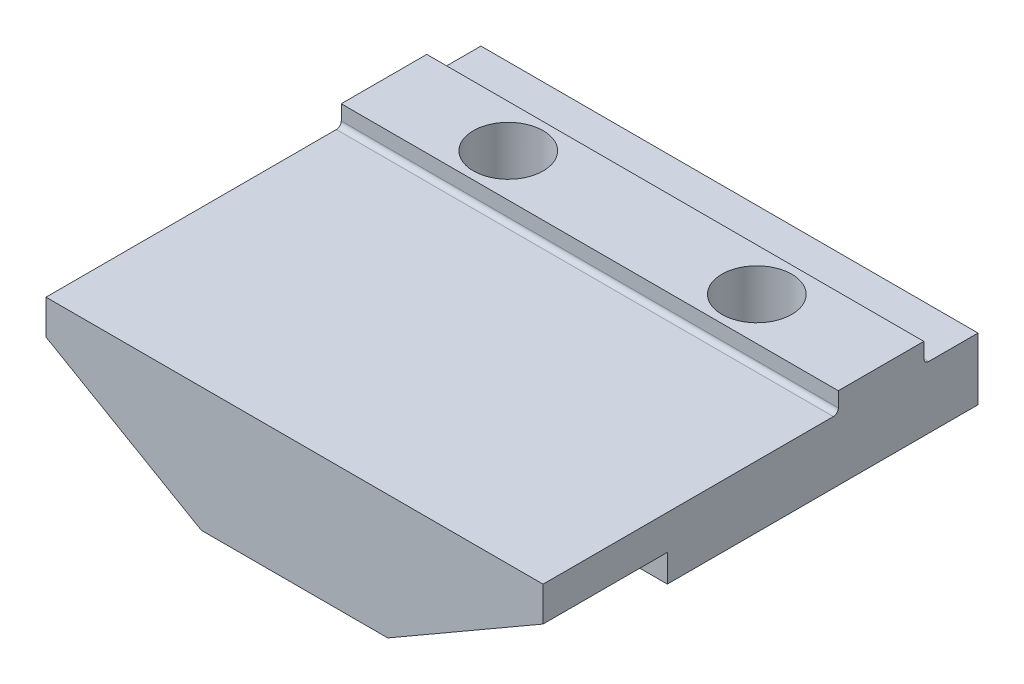
ISO-10303-21;
HEADER;
FILE_DESCRIPTION(('STEP AP214'),'2;1');
FILE_NAME('part.step','',(''),(''),'','','');
FILE_SCHEMA(('AUTOMOTIVE_DESIGN { 1 0 10303 214 1 1 1 1 }'));
ENDSEC;
DATA;
#1=APPLICATION_CONTEXT('core data for automotive mechanical design processes');
#2=APPLICATION_PROTOCOL_DEFINITION('international standard','automotive_design',2000,#1);
#3=PRODUCT_CONTEXT('',#1,'mechanical');
#4=PRODUCT('Part','Part','',(#3));
#5=PRODUCT_RELATED_PRODUCT_CATEGORY('part','',(#4));
#6=PRODUCT_DEFINITION_FORMATION('','',#4);
#7=PRODUCT_DEFINITION_CONTEXT('part definition',#1,'design');
#8=PRODUCT_DEFINITION('design','',#6,#7);
#9=PRODUCT_DEFINITION_SHAPE('','',#8);
#10=(LENGTH_UNIT() NAMED_UNIT(*) SI_UNIT(.MILLI.,.METRE.));
#11=(NAMED_UNIT(*) PLANE_ANGLE_UNIT() SI_UNIT($,.RADIAN.));
#12=(NAMED_UNIT(*) SI_UNIT($,.STERADIAN.) SOLID_ANGLE_UNIT());
#13=UNCERTAINTY_MEASURE_WITH_UNIT(LENGTH_MEASURE(1.E-05),#10,'distance_accuracy_value','');
#14=(GEOMETRIC_REPRESENTATION_CONTEXT(3) GLOBAL_UNCERTAINTY_ASSIGNED_CONTEXT((#13)) GLOBAL_UNIT_ASSIGNED_CONTEXT((#10,
#11,#12)) REPRESENTATION_CONTEXT('',''));
#15=CARTESIAN_POINT('',(0.,0.,0.));
#16=DIRECTION('',(0.,0.,1.));
#17=DIRECTION('',(1.,0.,0.));
#18=AXIS2_PLACEMENT_3D('',#15,#16,#17);
#19=CARTESIAN_POINT('',(0.,3.175,0.));
#20=DIRECTION('',(0.,-1.,0.));
#21=DIRECTION('',(0.,0.,-1.));
#22=AXIS2_PLACEMENT_3D('',#19,#20,#21);
#23=PLANE('',#22);
#24=DIRECTION('',(0.,0.,1.));
#25=VECTOR('',#24,1.);
#26=CARTESIAN_POINT('',(-25.4,3.175,22.225));
#27=LINE('',#26,#25);
#28=CARTESIAN_POINT('',(-25.4,3.175,-22.225));
#29=VERTEX_POINT('',#28);
#30=CARTESIAN_POINT('',(-25.4,3.175,-17.1958));
#31=VERTEX_POINT('',#30);
#32=EDGE_CURVE('E190',#29,#31,#27,.T.);
#33=ORIENTED_EDGE('',*,*,#32,.T.);
#34=DIRECTION('',(-1.,0.,0.));
#35=VECTOR('',#34,1.);
#36=CARTESIAN_POINT('',(25.4,3.175,-17.1958));
#37=LINE('',#36,#35);
#38=CARTESIAN_POINT('',(25.4,3.175,-17.1958));
#39=VERTEX_POINT('',#38);
#40=EDGE_CURVE('E62',#31,#39,#37,.F.);
#41=ORIENTED_EDGE('',*,*,#40,.T.);
#42=DIRECTION('',(0.,0.,-1.));
#43=VECTOR('',#42,1.);
#44=CARTESIAN_POINT('',(25.4,3.175,22.225));
#45=LINE('',#44,#43);
#46=CARTESIAN_POINT('',(25.4,3.175,-22.225));
#47=VERTEX_POINT('',#46);
#48=EDGE_CURVE('E187',#39,#47,#45,.T.);
#49=ORIENTED_EDGE('',*,*,#48,.T.);
#50=DIRECTION('',(-1.,0.,0.));
#51=VECTOR('',#50,1.);
#52=CARTESIAN_POINT('',(-25.4,3.175,-22.225));
#53=LINE('',#52,#51);
#54=EDGE_CURVE('E186',#47,#29,#53,.T.);
#55=ORIENTED_EDGE('',*,*,#54,.T.);
#56=EDGE_LOOP('',(#33,#41,#49,#55));
#57=FACE_BOUND('',#56,.T.);
#58=ADVANCED_FACE('F41',(#57),#23,.F.);
#59=CARTESIAN_POINT('',(25.4,3.175,22.225));
#60=VERTEX_POINT('',#59);
#61=CARTESIAN_POINT('',(25.4,3.175,-7.4422));
#62=VERTEX_POINT('',#61);
#63=EDGE_CURVE('E183',#60,#62,#45,.T.);
#64=ORIENTED_EDGE('',*,*,#63,.T.);
#65=DIRECTION('',(1.,0.,0.));
#66=VECTOR('',#65,1.);
#67=CARTESIAN_POINT('',(-25.4,3.175,-7.4422));
#68=LINE('',#67,#66);
#69=CARTESIAN_POINT('',(-25.4,3.175,-7.4422));
#70=VERTEX_POINT('',#69);
#71=EDGE_CURVE('E213',#62,#70,#68,.F.);
#72=ORIENTED_EDGE('',*,*,#71,.T.);
#73=CARTESIAN_POINT('',(-25.4,3.175,22.225));
#74=VERTEX_POINT('',#73);
#75=EDGE_CURVE('E189',#70,#74,#27,.T.);
#76=ORIENTED_EDGE('',*,*,#75,.T.);
#77=DIRECTION('',(1.,0.,0.));
#78=VECTOR('',#77,1.);
#79=CARTESIAN_POINT('',(-25.4,3.175,22.225));
#80=LINE('',#79,#78);
#81=EDGE_CURVE('E192',#74,#60,#80,.T.);
#82=ORIENTED_EDGE('',*,*,#81,.T.);
#83=EDGE_LOOP('',(#64,#72,#76,#82));
#84=FACE_BOUND('',#83,.T.);
#85=ADVANCED_FACE('F247',(#84),#23,.F.);
#86=CARTESIAN_POINT('',(0.,-3.175,0.));
#87=DIRECTION('',(0.,-1.,0.));
#88=DIRECTION('',(0.,0.,-1.));
#89=AXIS2_PLACEMENT_3D('',#86,#87,#88);
#90=PLANE('',#89);
#91=CARTESIAN_POINT('',(-12.7,-3.175,-12.319));
#92=DIRECTION('',(0.,-1.,0.));
#93=DIRECTION('',(0.,0.,-1.));
#94=AXIS2_PLACEMENT_3D('',#91,#92,#93);
#95=CIRCLE('',#94,3.5687);
#96=CARTESIAN_POINT('',(-12.7,-3.175,-15.8877));
#97=VERTEX_POINT('',#96);
#98=EDGE_CURVE('E499',#97,#97,#95,.F.);
#99=ORIENTED_EDGE('',*,*,#98,.T.);
#100=EDGE_LOOP('',(#99));
#101=FACE_BOUND('',#100,.T.);
#102=CARTESIAN_POINT('',(12.7,-3.175,-12.319));
#103=DIRECTION('',(0.,-1.,0.));
#104=DIRECTION('',(0.,0.,-1.));
#105=AXIS2_PLACEMENT_3D('',#102,#103,#104);
#106=CIRCLE('',#105,3.5687);
#107=CARTESIAN_POINT('',(12.7,-3.175,-15.8877));
#108=VERTEX_POINT('',#107);
#109=EDGE_CURVE('E503',#108,#108,#106,.F.);
#110=ORIENTED_EDGE('',*,*,#109,.T.);
#111=EDGE_LOOP('',(#110));
#112=FACE_BOUND('',#111,.T.);
#113=DIRECTION('',(0.,0.,-1.));
#114=VECTOR('',#113,1.);
#115=CARTESIAN_POINT('',(25.4,-3.175,22.225));
#116=LINE('',#115,#114);
#117=CARTESIAN_POINT('',(25.4,-3.175,9.525));
#118=VERTEX_POINT('',#117);
#119=CARTESIAN_POINT('',(25.4,-3.175,-22.225));
#120=VERTEX_POINT('',#119);
#121=EDGE_CURVE('E173',#118,#120,#116,.T.);
#122=ORIENTED_EDGE('',*,*,#121,.F.);
#123=DIRECTION('',(-1.,0.,0.));
#124=VECTOR('',#123,1.);
#125=CARTESIAN_POINT('',(-25.4,-3.175,9.525));
#126=LINE('',#125,#124);
#127=CARTESIAN_POINT('',(20.5235226280624,-3.17499999999999,9.525));
#128=VERTEX_POINT('',#127);
#129=EDGE_CURVE('E178',#118,#128,#126,.T.);
#130=ORIENTED_EDGE('',*,*,#129,.T.);
#131=CARTESIAN_POINT('',(-20.5235226280624,-3.175,9.525));
#132=VERTEX_POINT('',#131);
#133=EDGE_CURVE('E167',#128,#132,#126,.T.);
#134=ORIENTED_EDGE('',*,*,#133,.T.);
#135=DIRECTION('',(-1.,0.,0.));
#136=VECTOR('',#135,1.);
#137=CARTESIAN_POINT('',(0.,-3.175,9.525));
#138=LINE('',#137,#136);
#139=CARTESIAN_POINT('',(-25.4,-3.175,9.525));
#140=VERTEX_POINT('',#139);
#141=EDGE_CURVE('E267',#132,#140,#138,.T.);
#142=ORIENTED_EDGE('',*,*,#141,.T.);
#143=DIRECTION('',(0.,0.,1.));
#144=VECTOR('',#143,1.);
#145=CARTESIAN_POINT('',(-25.4,-3.175,22.225));
#146=LINE('',#145,#144);
#147=CARTESIAN_POINT('',(-25.4,-3.175,-22.225));
#148=VERTEX_POINT('',#147);
#149=EDGE_CURVE('E196',#148,#140,#146,.T.);
#150=ORIENTED_EDGE('',*,*,#149,.F.);
#151=DIRECTION('',(-1.,0.,0.));
#152=VECTOR('',#151,1.);
#153=CARTESIAN_POINT('',(-25.4,-3.175,-22.225));
#154=LINE('',#153,#152);
#155=EDGE_CURVE('E176',#120,#148,#154,.T.);
#156=ORIENTED_EDGE('',*,*,#155,.F.);
#157=EDGE_LOOP('',(#122,#130,#134,#142,#150,#156));
#158=FACE_BOUND('',#157,.T.);
#159=ADVANCED_FACE('F301',(#101,#112,#158),#90,.T.);
#160=CARTESIAN_POINT('',(25.4,3.175,22.225));
#161=DIRECTION('',(-1.,0.,0.));
#162=DIRECTION('',(0.,0.,1.));
#163=AXIS2_PLACEMENT_3D('',#160,#161,#162);
#164=PLANE('',#163);
#165=DIRECTION('',(0.,-1.,0.));
#166=VECTOR('',#165,1.);
#167=CARTESIAN_POINT('',(25.4,3.175,22.225));
#168=LINE('',#167,#166);
#169=CARTESIAN_POINT('',(25.4,-0.359564476614688,22.225));
#170=VERTEX_POINT('',#169);
#171=EDGE_CURVE('E193',#60,#170,#168,.T.);
#172=ORIENTED_EDGE('',*,*,#171,.T.);
#173=DIRECTION('',(0.,0.,-1.));
#174=VECTOR('',#173,1.);
#175=CARTESIAN_POINT('',(25.4,-0.359564476614694,22.225));
#176=LINE('',#175,#174);
#177=CARTESIAN_POINT('',(25.4,-0.359564476614692,9.525));
#178=VERTEX_POINT('',#177);
#179=EDGE_CURVE('E254',#170,#178,#176,.T.);
#180=ORIENTED_EDGE('',*,*,#179,.T.);
#181=DIRECTION('',(0.,1.,0.));
#182=VECTOR('',#181,1.);
#183=CARTESIAN_POINT('',(25.4,3.175,9.525));
#184=LINE('',#183,#182);
#185=EDGE_CURVE('E158',#118,#178,#184,.T.);
#186=ORIENTED_EDGE('',*,*,#185,.F.);
#187=ORIENTED_EDGE('',*,*,#121,.T.);
#188=DIRECTION('',(0.,-1.,0.));
#189=VECTOR('',#188,1.);
#190=CARTESIAN_POINT('',(25.4,3.175,-22.225));
#191=LINE('',#190,#189);
#192=EDGE_CURVE('E207',#47,#120,#191,.T.);
#193=ORIENTED_EDGE('',*,*,#192,.F.);
#194=ORIENTED_EDGE('',*,*,#48,.F.);
#195=CARTESIAN_POINT('',(25.4,3.683,-17.1958));
#196=DIRECTION('',(-1.,0.,0.));
#197=DIRECTION('',(0.,0.,1.));
#198=AXIS2_PLACEMENT_3D('',#195,#196,#197);
#199=CIRCLE('',#198,0.508);
#200=CARTESIAN_POINT('',(25.4,3.683,-16.6878));
#201=VERTEX_POINT('',#200);
#202=EDGE_CURVE('E11',#39,#201,#199,.T.);
#203=ORIENTED_EDGE('',*,*,#202,.T.);
#204=DIRECTION('',(0.,-1.,0.));
#205=VECTOR('',#204,1.);
#206=CARTESIAN_POINT('',(25.4,5.207,-16.6878));
#207=LINE('',#206,#205);
#208=CARTESIAN_POINT('',(25.4,5.207,-16.6878));
#209=VERTEX_POINT('',#208);
#210=EDGE_CURVE('E282',#209,#201,#207,.T.);
#211=ORIENTED_EDGE('',*,*,#210,.F.);
#212=DIRECTION('',(0.,0.,-1.));
#213=VECTOR('',#212,1.);
#214=CARTESIAN_POINT('',(25.4,5.207,-7.9502));
#215=LINE('',#214,#213);
#216=CARTESIAN_POINT('',(25.4,5.207,-7.9502));
#217=VERTEX_POINT('',#216);
#218=EDGE_CURVE('E276',#217,#209,#215,.T.);
#219=ORIENTED_EDGE('',*,*,#218,.F.);
#220=DIRECTION('',(0.,-1.,0.));
#221=VECTOR('',#220,1.);
#222=CARTESIAN_POINT('',(25.4,5.207,-7.9502));
#223=LINE('',#222,#221);
#224=CARTESIAN_POINT('',(25.4,3.683,-7.9502));
#225=VERTEX_POINT('',#224);
#226=EDGE_CURVE('E240',#217,#225,#223,.T.);
#227=ORIENTED_EDGE('',*,*,#226,.T.);
#228=CARTESIAN_POINT('',(25.4,3.683,-7.4422));
#229=DIRECTION('',(-1.,0.,0.));
#230=DIRECTION('',(0.,0.,1.));
#231=AXIS2_PLACEMENT_3D('',#228,#229,#230);
#232=CIRCLE('',#231,0.508);
#233=EDGE_CURVE('E219',#225,#62,#232,.T.);
#234=ORIENTED_EDGE('',*,*,#233,.T.);
#235=ORIENTED_EDGE('',*,*,#63,.F.);
#236=EDGE_LOOP('',(#172,#180,#186,#187,#193,#194,#203,#211,#219,#227,#234,#235));
#237=FACE_BOUND('',#236,.T.);
#238=ADVANCED_FACE('F244',(#237),#164,.F.);
#239=CARTESIAN_POINT('',(-25.4,3.175,-22.225));
#240=DIRECTION('',(0.,0.,1.));
#241=DIRECTION('',(1.,0.,0.));
#242=AXIS2_PLACEMENT_3D('',#239,#240,#241);
#243=PLANE('',#242);
#244=ORIENTED_EDGE('',*,*,#155,.T.);
#245=DIRECTION('',(0.,-1.,0.));
#246=VECTOR('',#245,1.);
#247=CARTESIAN_POINT('',(-25.4,3.175,-22.225));
#248=LINE('',#247,#246);
#249=EDGE_CURVE('E204',#29,#148,#248,.T.);
#250=ORIENTED_EDGE('',*,*,#249,.F.);
#251=ORIENTED_EDGE('',*,*,#54,.F.);
#252=ORIENTED_EDGE('',*,*,#192,.T.);
#253=EDGE_LOOP('',(#244,#250,#251,#252));
#254=FACE_BOUND('',#253,.T.);
#255=ADVANCED_FACE('F297',(#254),#243,.F.);
#256=CARTESIAN_POINT('',(-25.4,3.175,22.225));
#257=DIRECTION('',(1.,0.,0.));
#258=DIRECTION('',(0.,0.,-1.));
#259=AXIS2_PLACEMENT_3D('',#256,#257,#258);
#260=PLANE('',#259);
#261=DIRECTION('',(0.,-1.,0.));
#262=VECTOR('',#261,1.);
#263=CARTESIAN_POINT('',(-25.4,3.175,9.525));
#264=LINE('',#263,#262);
#265=CARTESIAN_POINT('',(-25.4,-0.359564476614687,9.525));
#266=VERTEX_POINT('',#265);
#267=EDGE_CURVE('E265',#266,#140,#264,.T.);
#268=ORIENTED_EDGE('',*,*,#267,.F.);
#269=DIRECTION('',(0.,0.,1.));
#270=VECTOR('',#269,1.);
#271=CARTESIAN_POINT('',(-25.4,-0.359564476614688,22.225));
#272=LINE('',#271,#270);
#273=CARTESIAN_POINT('',(-25.4,-0.359564476614687,22.225));
#274=VERTEX_POINT('',#273);
#275=EDGE_CURVE('E270',#266,#274,#272,.T.);
#276=ORIENTED_EDGE('',*,*,#275,.T.);
#277=DIRECTION('',(0.,-1.,0.));
#278=VECTOR('',#277,1.);
#279=CARTESIAN_POINT('',(-25.4,3.175,22.225));
#280=LINE('',#279,#278);
#281=EDGE_CURVE('E201',#74,#274,#280,.T.);
#282=ORIENTED_EDGE('',*,*,#281,.F.);
#283=ORIENTED_EDGE('',*,*,#75,.F.);
#284=CARTESIAN_POINT('',(-25.4,3.683,-7.4422));
#285=DIRECTION('',(1.,0.,0.));
#286=DIRECTION('',(0.,0.,-1.));
#287=AXIS2_PLACEMENT_3D('',#284,#285,#286);
#288=CIRCLE('',#287,0.508);
#289=CARTESIAN_POINT('',(-25.4,3.683,-7.9502));
#290=VERTEX_POINT('',#289);
#291=EDGE_CURVE('E221',#70,#290,#288,.T.);
#292=ORIENTED_EDGE('',*,*,#291,.T.);
#293=DIRECTION('',(0.,-1.,0.));
#294=VECTOR('',#293,1.);
#295=CARTESIAN_POINT('',(-25.4,5.207,-7.9502));
#296=LINE('',#295,#294);
#297=CARTESIAN_POINT('',(-25.4,5.207,-7.9502));
#298=VERTEX_POINT('',#297);
#299=EDGE_CURVE('E229',#298,#290,#296,.T.);
#300=ORIENTED_EDGE('',*,*,#299,.F.);
#301=DIRECTION('',(0.,0.,1.));
#302=VECTOR('',#301,1.);
#303=CARTESIAN_POINT('',(-25.4,5.207,-7.9502));
#304=LINE('',#303,#302);
#305=CARTESIAN_POINT('',(-25.4,5.207,-16.6878));
#306=VERTEX_POINT('',#305);
#307=EDGE_CURVE('E273',#306,#298,#304,.T.);
#308=ORIENTED_EDGE('',*,*,#307,.F.);
#309=DIRECTION('',(0.,-1.,0.));
#310=VECTOR('',#309,1.);
#311=CARTESIAN_POINT('',(-25.4,5.207,-16.6878));
#312=LINE('',#311,#310);
#313=CARTESIAN_POINT('',(-25.4,3.683,-16.6878));
#314=VERTEX_POINT('',#313);
#315=EDGE_CURVE('E280',#306,#314,#312,.T.);
#316=ORIENTED_EDGE('',*,*,#315,.T.);
#317=CARTESIAN_POINT('',(-25.4,3.683,-17.1958));
#318=DIRECTION('',(1.,0.,0.));
#319=DIRECTION('',(0.,0.,-1.));
#320=AXIS2_PLACEMENT_3D('',#317,#318,#319);
#321=CIRCLE('',#320,0.508);
#322=EDGE_CURVE('E49',#314,#31,#321,.T.);
#323=ORIENTED_EDGE('',*,*,#322,.T.);
#324=ORIENTED_EDGE('',*,*,#32,.F.);
#325=ORIENTED_EDGE('',*,*,#249,.T.);
#326=ORIENTED_EDGE('',*,*,#149,.T.);
#327=EDGE_LOOP('',(#268,#276,#282,#283,#292,#300,#308,#316,#323,#324,#325,#326));
#328=FACE_BOUND('',#327,.T.);
#329=ADVANCED_FACE('F227',(#328),#260,.F.);
#330=CARTESIAN_POINT('',(-25.4,3.175,22.225));
#331=DIRECTION('',(0.,0.,-1.));
#332=DIRECTION('',(-1.,0.,0.));
#333=AXIS2_PLACEMENT_3D('',#330,#331,#332);
#334=PLANE('',#333);
#335=DIRECTION('',(1.,0.,0.));
#336=VECTOR('',#335,1.);
#337=CARTESIAN_POINT('',(-25.4,-9.525,22.225));
#338=LINE('',#337,#336);
#339=CARTESIAN_POINT('',(-9.525,-9.525,22.225));
#340=VERTEX_POINT('',#339);
#341=CARTESIAN_POINT('',(9.525,-9.525,22.225));
#342=VERTEX_POINT('',#341);
#343=EDGE_CURVE('E174',#340,#342,#338,.T.);
#344=ORIENTED_EDGE('',*,*,#343,.T.);
#345=DIRECTION('',(-0.866025403784439,-0.5,0.));
#346=VECTOR('',#345,1.);
#347=CARTESIAN_POINT('',(76.2,28.9698291982183,22.225));
#348=LINE('',#347,#346);
#349=EDGE_CURVE('E153',#170,#342,#348,.T.);
#350=ORIENTED_EDGE('',*,*,#349,.F.);
#351=ORIENTED_EDGE('',*,*,#171,.F.);
#352=ORIENTED_EDGE('',*,*,#81,.F.);
#353=ORIENTED_EDGE('',*,*,#281,.T.);
#354=DIRECTION('',(-0.866025403784439,0.5,0.));
#355=VECTOR('',#354,1.);
#356=CARTESIAN_POINT('',(-9.525,-9.525,22.225));
#357=LINE('',#356,#355);
#358=EDGE_CURVE('E256',#340,#274,#357,.T.);
#359=ORIENTED_EDGE('',*,*,#358,.F.);
#360=EDGE_LOOP('',(#344,#350,#351,#352,#353,#359));
#361=FACE_BOUND('',#360,.T.);
#362=ADVANCED_FACE('F251',(#361),#334,.F.);
#363=CARTESIAN_POINT('',(-25.4,-9.525,9.525));
#364=DIRECTION('',(0.,0.,-1.));
#365=DIRECTION('',(-1.,0.,0.));
#366=AXIS2_PLACEMENT_3D('',#363,#364,#365);
#367=PLANE('',#366);
#368=DIRECTION('',(-0.866025403784439,-0.5,0.));
#369=VECTOR('',#368,1.);
#370=CARTESIAN_POINT('',(76.2,28.9698291982183,9.525));
#371=LINE('',#370,#369);
#372=CARTESIAN_POINT('',(9.525,-9.525,9.525));
#373=VERTEX_POINT('',#372);
#374=EDGE_CURVE('E150',#128,#373,#371,.T.);
#375=ORIENTED_EDGE('',*,*,#374,.T.);
#376=DIRECTION('',(-1.,0.,0.));
#377=VECTOR('',#376,1.);
#378=CARTESIAN_POINT('',(-25.4,-9.525,9.525));
#379=LINE('',#378,#377);
#380=CARTESIAN_POINT('',(-9.525,-9.525,9.525));
#381=VERTEX_POINT('',#380);
#382=EDGE_CURVE('E165',#373,#381,#379,.T.);
#383=ORIENTED_EDGE('',*,*,#382,.T.);
#384=DIRECTION('',(-0.866025403784439,0.5,0.));
#385=VECTOR('',#384,1.);
#386=CARTESIAN_POINT('',(-9.525,-9.525,9.525));
#387=LINE('',#386,#385);
#388=EDGE_CURVE('E262',#381,#132,#387,.T.);
#389=ORIENTED_EDGE('',*,*,#388,.T.);
#390=ORIENTED_EDGE('',*,*,#133,.F.);
#391=EDGE_LOOP('',(#375,#383,#389,#390));
#392=FACE_BOUND('',#391,.T.);
#393=ADVANCED_FACE('F163',(#392),#367,.T.);
#394=CARTESIAN_POINT('',(0.,-9.525,0.));
#395=DIRECTION('',(0.,-1.,0.));
#396=DIRECTION('',(0.,0.,-1.));
#397=AXIS2_PLACEMENT_3D('',#394,#395,#396);
#398=PLANE('',#397);
#399=DIRECTION('',(0.,0.,1.));
#400=VECTOR('',#399,1.);
#401=CARTESIAN_POINT('',(9.525,-9.525,9.525));
#402=LINE('',#401,#400);
#403=EDGE_CURVE('E146',#373,#342,#402,.T.);
#404=ORIENTED_EDGE('',*,*,#403,.T.);
#405=ORIENTED_EDGE('',*,*,#343,.F.);
#406=DIRECTION('',(0.,0.,1.));
#407=VECTOR('',#406,1.);
#408=CARTESIAN_POINT('',(-9.525,-9.525,9.525));
#409=LINE('',#408,#407);
#410=EDGE_CURVE('E172',#381,#340,#409,.T.);
#411=ORIENTED_EDGE('',*,*,#410,.F.);
#412=ORIENTED_EDGE('',*,*,#382,.F.);
#413=EDGE_LOOP('',(#404,#405,#411,#412));
#414=FACE_BOUND('',#413,.T.);
#415=ADVANCED_FACE('F171',(#414),#398,.T.);
#416=CARTESIAN_POINT('',(-25.4,5.207,-7.9502));
#417=DIRECTION('',(0.,0.,-1.));
#418=DIRECTION('',(-1.,0.,0.));
#419=AXIS2_PLACEMENT_3D('',#416,#417,#418);
#420=PLANE('',#419);
#421=ORIENTED_EDGE('',*,*,#299,.T.);
#422=DIRECTION('',(1.,0.,0.));
#423=VECTOR('',#422,1.);
#424=CARTESIAN_POINT('',(25.4,3.683,-7.9502));
#425=LINE('',#424,#423);
#426=EDGE_CURVE('E210',#290,#225,#425,.T.);
#427=ORIENTED_EDGE('',*,*,#426,.T.);
#428=ORIENTED_EDGE('',*,*,#226,.F.);
#429=DIRECTION('',(1.,0.,0.));
#430=VECTOR('',#429,1.);
#431=CARTESIAN_POINT('',(-25.4,5.207,-7.9502));
#432=LINE('',#431,#430);
#433=EDGE_CURVE('E238',#298,#217,#432,.T.);
#434=ORIENTED_EDGE('',*,*,#433,.F.);
#435=EDGE_LOOP('',(#421,#427,#428,#434));
#436=FACE_BOUND('',#435,.T.);
#437=ADVANCED_FACE('F235',(#436),#420,.F.);
#438=CARTESIAN_POINT('',(-25.4,5.207,-16.6878));
#439=DIRECTION('',(0.,0.,1.));
#440=DIRECTION('',(1.,0.,0.));
#441=AXIS2_PLACEMENT_3D('',#438,#439,#440);
#442=PLANE('',#441);
#443=ORIENTED_EDGE('',*,*,#210,.T.);
#444=DIRECTION('',(-1.,0.,0.));
#445=VECTOR('',#444,1.);
#446=CARTESIAN_POINT('',(-25.4,3.683,-16.6878));
#447=LINE('',#446,#445);
#448=EDGE_CURVE('E215',#201,#314,#447,.T.);
#449=ORIENTED_EDGE('',*,*,#448,.T.);
#450=ORIENTED_EDGE('',*,*,#315,.F.);
#451=DIRECTION('',(-1.,0.,0.));
#452=VECTOR('',#451,1.);
#453=CARTESIAN_POINT('',(-25.4,5.207,-16.6878));
#454=LINE('',#453,#452);
#455=EDGE_CURVE('E278',#209,#306,#454,.T.);
#456=ORIENTED_EDGE('',*,*,#455,.F.);
#457=EDGE_LOOP('',(#443,#449,#450,#456));
#458=FACE_BOUND('',#457,.T.);
#459=ADVANCED_FACE('F289',(#458),#442,.F.);
#460=CARTESIAN_POINT('',(0.,5.207,0.));
#461=DIRECTION('',(0.,-1.,0.));
#462=DIRECTION('',(0.,0.,-1.));
#463=AXIS2_PLACEMENT_3D('',#460,#461,#462);
#464=PLANE('',#463);
#465=CARTESIAN_POINT('',(-12.7,5.207,-12.319));
#466=DIRECTION('',(0.,1.,0.));
#467=DIRECTION('',(0.,0.,1.));
#468=AXIS2_PLACEMENT_3D('',#465,#466,#467);
#469=CIRCLE('',#468,3.5687);
#470=CARTESIAN_POINT('',(-12.7,5.207,-8.7503));
#471=VERTEX_POINT('',#470);
#472=EDGE_CURVE('E497',#471,#471,#469,.T.);
#473=ORIENTED_EDGE('',*,*,#472,.F.);
#474=EDGE_LOOP('',(#473));
#475=FACE_BOUND('',#474,.T.);
#476=CARTESIAN_POINT('',(12.7,5.207,-12.319));
#477=DIRECTION('',(0.,1.,0.));
#478=DIRECTION('',(0.,0.,1.));
#479=AXIS2_PLACEMENT_3D('',#476,#477,#478);
#480=CIRCLE('',#479,3.5687);
#481=CARTESIAN_POINT('',(12.7,5.207,-8.7503));
#482=VERTEX_POINT('',#481);
#483=EDGE_CURVE('E495',#482,#482,#480,.T.);
#484=ORIENTED_EDGE('',*,*,#483,.F.);
#485=EDGE_LOOP('',(#484));
#486=FACE_BOUND('',#485,.T.);
#487=ORIENTED_EDGE('',*,*,#307,.T.);
#488=ORIENTED_EDGE('',*,*,#433,.T.);
#489=ORIENTED_EDGE('',*,*,#218,.T.);
#490=ORIENTED_EDGE('',*,*,#455,.T.);
#491=EDGE_LOOP('',(#487,#488,#489,#490));
#492=FACE_BOUND('',#491,.T.);
#493=ADVANCED_FACE('F311',(#475,#486,#492),#464,.F.);
#494=CARTESIAN_POINT('',(-9.525,-9.525,9.525));
#495=DIRECTION('',(0.5,0.866025403784439,0.));
#496=DIRECTION('',(-0.866025403784439,0.5,0.));
#497=AXIS2_PLACEMENT_3D('',#494,#495,#496);
#498=PLANE('',#497);
#499=EDGE_CURVE('E258',#132,#266,#387,.T.);
#500=ORIENTED_EDGE('',*,*,#499,.F.);
#501=ORIENTED_EDGE('',*,*,#388,.F.);
#502=ORIENTED_EDGE('',*,*,#410,.T.);
#503=ORIENTED_EDGE('',*,*,#358,.T.);
#504=ORIENTED_EDGE('',*,*,#275,.F.);
#505=EDGE_LOOP('',(#500,#501,#502,#503,#504));
#506=FACE_BOUND('',#505,.T.);
#507=ADVANCED_FACE('F308',(#506),#498,.F.);
#508=CARTESIAN_POINT('',(0.,0.,9.525));
#509=DIRECTION('',(0.,0.,1.));
#510=DIRECTION('',(1.,0.,0.));
#511=AXIS2_PLACEMENT_3D('',#508,#509,#510);
#512=PLANE('',#511);
#513=ORIENTED_EDGE('',*,*,#499,.T.);
#514=ORIENTED_EDGE('',*,*,#267,.T.);
#515=ORIENTED_EDGE('',*,*,#141,.F.);
#516=EDGE_LOOP('',(#513,#514,#515));
#517=FACE_BOUND('',#516,.T.);
#518=ADVANCED_FACE('F306',(#517),#512,.T.);
#519=CARTESIAN_POINT('',(76.2,28.9698291982183,9.525));
#520=DIRECTION('',(-0.5,0.866025403784439,0.));
#521=DIRECTION('',(-0.866025403784439,-0.5,0.));
#522=AXIS2_PLACEMENT_3D('',#519,#520,#521);
#523=PLANE('',#522);
#524=ORIENTED_EDGE('',*,*,#349,.T.);
#525=ORIENTED_EDGE('',*,*,#403,.F.);
#526=ORIENTED_EDGE('',*,*,#374,.F.);
#527=EDGE_CURVE('E159',#178,#128,#371,.T.);
#528=ORIENTED_EDGE('',*,*,#527,.F.);
#529=ORIENTED_EDGE('',*,*,#179,.F.);
#530=EDGE_LOOP('',(#524,#525,#526,#528,#529));
#531=FACE_BOUND('',#530,.T.);
#532=ADVANCED_FACE('F148',(#531),#523,.F.);
#533=CARTESIAN_POINT('',(0.,0.,9.525));
#534=DIRECTION('',(0.,0.,1.));
#535=DIRECTION('',(1.,0.,0.));
#536=AXIS2_PLACEMENT_3D('',#533,#534,#535);
#537=PLANE('',#536);
#538=ORIENTED_EDGE('',*,*,#185,.T.);
#539=ORIENTED_EDGE('',*,*,#527,.T.);
#540=ORIENTED_EDGE('',*,*,#129,.F.);
#541=EDGE_LOOP('',(#538,#539,#540));
#542=FACE_BOUND('',#541,.T.);
#543=ADVANCED_FACE('F351',(#542),#537,.T.);
#544=CARTESIAN_POINT('',(12.7,-9.525,-12.319));
#545=DIRECTION('',(0.,1.,0.));
#546=DIRECTION('',(0.,0.,1.));
#547=AXIS2_PLACEMENT_3D('',#544,#545,#546);
#548=CYLINDRICAL_SURFACE('',#547,3.5687);
#549=ORIENTED_EDGE('',*,*,#109,.F.);
#550=EDGE_LOOP('',(#549));
#551=FACE_BOUND('',#550,.T.);
#552=ORIENTED_EDGE('',*,*,#483,.T.);
#553=EDGE_LOOP('',(#552));
#554=FACE_BOUND('',#553,.T.);
#555=ADVANCED_FACE('F345',(#551,#554),#548,.F.);
#556=CARTESIAN_POINT('',(-12.7,-9.525,-12.319));
#557=DIRECTION('',(0.,1.,0.));
#558=DIRECTION('',(0.,0.,1.));
#559=AXIS2_PLACEMENT_3D('',#556,#557,#558);
#560=CYLINDRICAL_SURFACE('',#559,3.5687);
#561=ORIENTED_EDGE('',*,*,#98,.F.);
#562=EDGE_LOOP('',(#561));
#563=FACE_BOUND('',#562,.T.);
#564=ORIENTED_EDGE('',*,*,#472,.T.);
#565=EDGE_LOOP('',(#564));
#566=FACE_BOUND('',#565,.T.);
#567=ADVANCED_FACE('F340',(#563,#566),#560,.F.);
#568=CARTESIAN_POINT('',(-25.4,3.683,-7.4422));
#569=DIRECTION('',(-1.,0.,0.));
#570=DIRECTION('',(0.,0.,1.));
#571=AXIS2_PLACEMENT_3D('',#568,#569,#570);
#572=CYLINDRICAL_SURFACE('',#571,0.508);
#573=ORIENTED_EDGE('',*,*,#291,.F.);
#574=ORIENTED_EDGE('',*,*,#71,.F.);
#575=ORIENTED_EDGE('',*,*,#233,.F.);
#576=ORIENTED_EDGE('',*,*,#426,.F.);
#577=EDGE_LOOP('',(#573,#574,#575,#576));
#578=FACE_BOUND('',#577,.T.);
#579=ADVANCED_FACE('F241',(#578),#572,.F.);
#580=CARTESIAN_POINT('',(-25.4,3.683,-17.1958));
#581=DIRECTION('',(1.,0.,0.));
#582=DIRECTION('',(0.,0.,-1.));
#583=AXIS2_PLACEMENT_3D('',#580,#581,#582);
#584=CYLINDRICAL_SURFACE('',#583,0.508);
#585=ORIENTED_EDGE('',*,*,#202,.F.);
#586=ORIENTED_EDGE('',*,*,#40,.F.);
#587=ORIENTED_EDGE('',*,*,#322,.F.);
#588=ORIENTED_EDGE('',*,*,#448,.F.);
#589=EDGE_LOOP('',(#585,#586,#587,#588));
#590=FACE_BOUND('',#589,.T.);
#591=ADVANCED_FACE('F43',(#590),#584,.F.);
#592=CLOSED_SHELL('',(#58,#85,#159,#238,#255,#329,#362,#393,#415,#437,#459,#493,#507,#518,#532,
#543,#555,#567,#579,#591));
#593=MANIFOLD_SOLID_BREP('B2',#592);
#594=ADVANCED_BREP_SHAPE_REPRESENTATION('',(#18,#593),#14);
#595=SHAPE_DEFINITION_REPRESENTATION(#9,#594);
ENDSEC;
END-ISO-10303-21;
